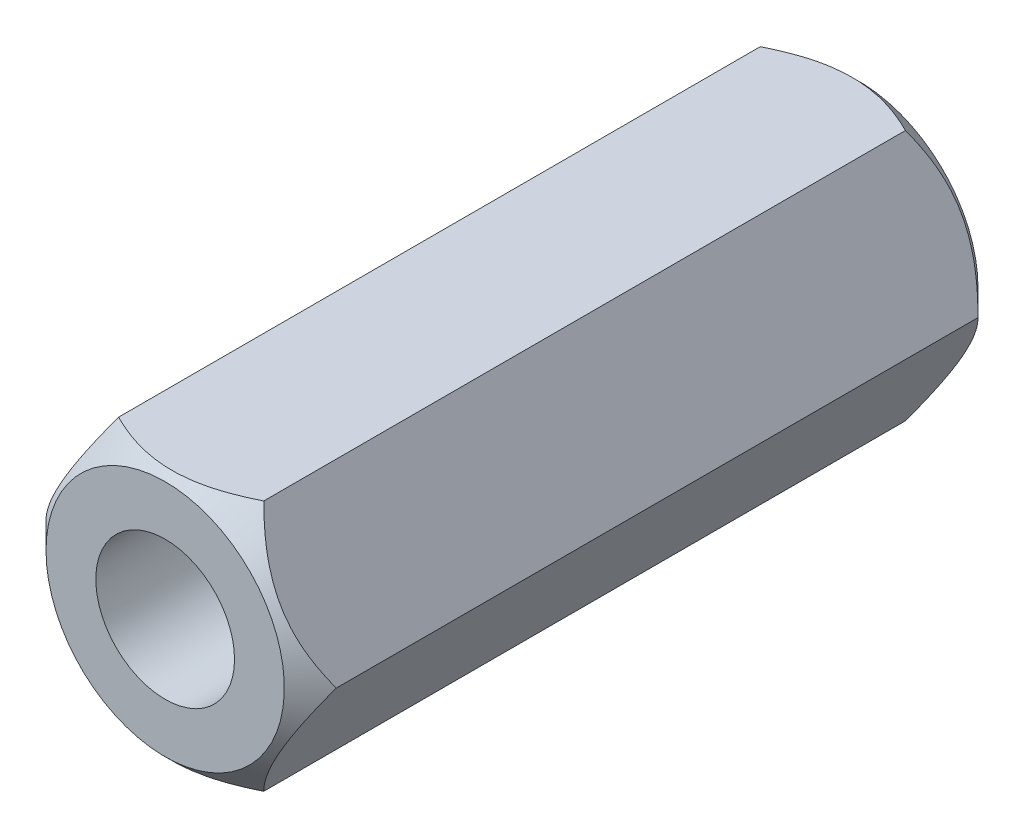
ISO-10303-21;
HEADER;
FILE_DESCRIPTION(('STEP AP214'),'2;1');
FILE_NAME('part.step','',(''),(''),'','','');
FILE_SCHEMA(('AUTOMOTIVE_DESIGN { 1 0 10303 214 1 1 1 1 }'));
ENDSEC;
DATA;
#1=APPLICATION_CONTEXT('core data for automotive mechanical design processes');
#2=APPLICATION_PROTOCOL_DEFINITION('international standard','automotive_design',2000,#1);
#3=PRODUCT_CONTEXT('',#1,'mechanical');
#4=PRODUCT('Part','Part','',(#3));
#5=PRODUCT_RELATED_PRODUCT_CATEGORY('part','',(#4));
#6=PRODUCT_DEFINITION_FORMATION('','',#4);
#7=PRODUCT_DEFINITION_CONTEXT('part definition',#1,'design');
#8=PRODUCT_DEFINITION('design','',#6,#7);
#9=PRODUCT_DEFINITION_SHAPE('','',#8);
#10=(LENGTH_UNIT() NAMED_UNIT(*) SI_UNIT(.MILLI.,.METRE.));
#11=(NAMED_UNIT(*) PLANE_ANGLE_UNIT() SI_UNIT($,.RADIAN.));
#12=(NAMED_UNIT(*) SI_UNIT($,.STERADIAN.) SOLID_ANGLE_UNIT());
#13=UNCERTAINTY_MEASURE_WITH_UNIT(LENGTH_MEASURE(1.E-05),#10,'distance_accuracy_value','');
#14=(GEOMETRIC_REPRESENTATION_CONTEXT(3) GLOBAL_UNCERTAINTY_ASSIGNED_CONTEXT((#13)) GLOBAL_UNIT_ASSIGNED_CONTEXT((#10,
#11,#12)) REPRESENTATION_CONTEXT('',''));
#15=CARTESIAN_POINT('',(0.,0.,0.));
#16=DIRECTION('',(0.,0.,1.));
#17=DIRECTION('',(1.,0.,0.));
#18=AXIS2_PLACEMENT_3D('',#15,#16,#17);
#19=CARTESIAN_POINT('',(0.,0.,4.));
#20=DIRECTION('',(0.,0.,1.));
#21=DIRECTION('',(1.,0.,0.));
#22=AXIS2_PLACEMENT_3D('',#19,#20,#21);
#23=PLANE('',#22);
#24=CARTESIAN_POINT('',(0.,0.,4.));
#25=DIRECTION('',(0.,0.,1.));
#26=DIRECTION('',(1.,0.,0.));
#27=AXIS2_PLACEMENT_3D('',#24,#25,#26);
#28=CIRCLE('',#27,0.799999999999988);
#29=CARTESIAN_POINT('',(0.799999999999988,0.,4.));
#30=VERTEX_POINT('',#29);
#31=EDGE_CURVE('E234',#30,#30,#28,.T.);
#32=ORIENTED_EDGE('',*,*,#31,.F.);
#33=EDGE_LOOP('',(#32));
#34=FACE_BOUND('',#33,.T.);
#35=CARTESIAN_POINT('',(0.,0.,4.));
#36=DIRECTION('',(0.,0.,-1.));
#37=DIRECTION('',(-1.,0.,0.));
#38=AXIS2_PLACEMENT_3D('',#35,#36,#37);
#39=CIRCLE('',#38,1.37431578064992);
#40=CARTESIAN_POINT('',(-1.37431578064992,0.,4.));
#41=VERTEX_POINT('',#40);
#42=EDGE_CURVE('E251',#41,#41,#39,.T.);
#43=ORIENTED_EDGE('',*,*,#42,.F.);
#44=EDGE_LOOP('',(#43));
#45=FACE_BOUND('',#44,.T.);
#46=ADVANCED_FACE('F43',(#34,#45),#23,.T.);
#47=CARTESIAN_POINT('',(0.,0.,-4.));
#48=DIRECTION('',(0.,0.,1.));
#49=DIRECTION('',(1.,0.,0.));
#50=AXIS2_PLACEMENT_3D('',#47,#48,#49);
#51=PLANE('',#50);
#52=CARTESIAN_POINT('',(0.,0.,-4.));
#53=DIRECTION('',(0.,0.,1.));
#54=DIRECTION('',(1.,0.,0.));
#55=AXIS2_PLACEMENT_3D('',#52,#53,#54);
#56=CIRCLE('',#55,0.799999999999998);
#57=CARTESIAN_POINT('',(0.799999999999998,0.,-4.));
#58=VERTEX_POINT('',#57);
#59=EDGE_CURVE('E238',#58,#58,#56,.T.);
#60=ORIENTED_EDGE('',*,*,#59,.T.);
#61=EDGE_LOOP('',(#60));
#62=FACE_BOUND('',#61,.T.);
#63=CARTESIAN_POINT('',(0.,0.,-4.));
#64=DIRECTION('',(0.,0.,-1.));
#65=DIRECTION('',(-1.,0.,0.));
#66=AXIS2_PLACEMENT_3D('',#63,#64,#65);
#67=CIRCLE('',#66,1.37431578064992);
#68=CARTESIAN_POINT('',(-1.37431578064992,0.,-4.));
#69=VERTEX_POINT('',#68);
#70=EDGE_CURVE('E248',#69,#69,#67,.T.);
#71=ORIENTED_EDGE('',*,*,#70,.T.);
#72=EDGE_LOOP('',(#71));
#73=FACE_BOUND('',#72,.T.);
#74=ADVANCED_FACE('F261',(#62,#73),#51,.F.);
#75=CARTESIAN_POINT('',(0.,0.,4.));
#76=DIRECTION('',(0.,0.,1.));
#77=DIRECTION('',(1.,0.,0.));
#78=AXIS2_PLACEMENT_3D('',#75,#76,#77);
#79=CYLINDRICAL_SURFACE('',#78,0.799999999999993);
#80=ORIENTED_EDGE('',*,*,#59,.F.);
#81=EDGE_LOOP('',(#80));
#82=FACE_BOUND('',#81,.T.);
#83=ORIENTED_EDGE('',*,*,#31,.T.);
#84=EDGE_LOOP('',(#83));
#85=FACE_BOUND('',#84,.T.);
#86=ADVANCED_FACE('F170',(#82,#85),#79,.F.);
#87=CARTESIAN_POINT('',(0.,0.,-3.7));
#88=DIRECTION('',(0.,0.,1.));
#89=DIRECTION('',(1.,0.,0.));
#90=AXIS2_PLACEMENT_3D('',#87,#88,#89);
#91=CONICAL_SURFACE('',#90,1.67431578064992,0.785398163397448);
#92=ORIENTED_EDGE('',*,*,#70,.F.);
#93=EDGE_LOOP('',(#92));
#94=FACE_BOUND('',#93,.T.);
#95=CARTESIAN_POINT('',(-2.53833799994803,-1.45,-2.45101972961776));
#96=CARTESIAN_POINT('',(-2.46331836099104,-1.45,-2.51613488539001));
#97=CARTESIAN_POINT('',(-2.38796727676874,-1.45,-2.58087601176472));
#98=CARTESIAN_POINT('',(-2.2363448947353,-1.45,-2.70934341764731));
#99=CARTESIAN_POINT('',(-2.16007317934021,-1.45,-2.77306920368599));
#100=CARTESIAN_POINT('',(-2.00468115799849,-1.45,-2.90060639963365));
#101=CARTESIAN_POINT('',(-1.92553547139429,-1.45,-2.96438700631668));
#102=CARTESIAN_POINT('',(-1.76575977044845,-1.45,-3.09002890579821));
#103=CARTESIAN_POINT('',(-1.68513013223553,-1.45,-3.15189067456299));
#104=CARTESIAN_POINT('',(-1.52178885563397,-1.45,-3.27304693672898));
#105=CARTESIAN_POINT('',(-1.43907464072097,-1.45,-3.33233797910738));
#106=CARTESIAN_POINT('',(-1.27093360969132,-1.45,-3.44714446678887));
#107=CARTESIAN_POINT('',(-1.18550465811648,-1.45,-3.50265682618678));
#108=CARTESIAN_POINT('',(-1.01179486194413,-1.45,-3.6075512939217));
#109=CARTESIAN_POINT('',(-0.92354032153754,-1.45,-3.65697639694552));
#110=CARTESIAN_POINT('',(-0.742673963133198,-1.45,-3.74706700163955));
#111=CARTESIAN_POINT('',(-0.650070491246379,-1.45,-3.78774850845891));
#112=CARTESIAN_POINT('',(-0.506446914842503,-1.45,-3.83908338779738));
#113=CARTESIAN_POINT('',(-0.457208808287958,-1.45,-3.85469812139962));
#114=CARTESIAN_POINT('',(-0.357560892138793,-1.45,-3.88165030843698));
#115=CARTESIAN_POINT('',(-0.307151270712443,-1.45,-3.89298844380541));
#116=CARTESIAN_POINT('',(-0.205770605157881,-1.45,-3.91063230196171));
#117=CARTESIAN_POINT('',(-0.154805120303523,-1.45,-3.91696936693882));
#118=CARTESIAN_POINT('',(-0.0524873193731552,-1.45,-3.92426298630389));
#119=CARTESIAN_POINT('',(-0.00113504720931681,-1.45,-3.92522014252399));
#120=CARTESIAN_POINT('',(0.101458755992196,-1.45,-3.92167662095126));
#121=CARTESIAN_POINT('',(0.152699978541413,-1.45,-3.91716721133384));
#122=CARTESIAN_POINT('',(0.254464432244144,-1.45,-3.90302058988481));
#123=CARTESIAN_POINT('',(0.304987517702617,-1.45,-3.89338235234612));
#124=CARTESIAN_POINT('',(0.405306713404249,-1.45,-3.86953024584431));
#125=CARTESIAN_POINT('',(0.455094973757805,-1.45,-3.85528394250204));
#126=CARTESIAN_POINT('',(0.553405063344329,-1.45,-3.82299384050317));
#127=CARTESIAN_POINT('',(0.601926872423667,-1.45,-3.80494998145566));
#128=CARTESIAN_POINT('',(0.708123175053308,-1.45,-3.76152201727827));
#129=CARTESIAN_POINT('',(0.765491264486616,-1.45,-3.73539506982482));
#130=CARTESIAN_POINT('',(0.87852163365182,-1.45,-3.67965307301422));
#131=CARTESIAN_POINT('',(0.934182909626428,-1.45,-3.65003601892923));
#132=CARTESIAN_POINT('',(1.04410278476866,-1.45,-3.58809496846838));
#133=CARTESIAN_POINT('',(1.09835857859814,-1.45,-3.55576603352409));
#134=CARTESIAN_POINT('',(1.2055979748998,-1.45,-3.48905454416926));
#135=CARTESIAN_POINT('',(1.25858132118061,-1.45,-3.45467158098587));
#136=CARTESIAN_POINT('',(1.41647415900858,-1.45,-3.34879406520293));
#137=CARTESIAN_POINT('',(1.51976889808603,-1.45,-3.27489782236396));
#138=CARTESIAN_POINT('',(1.72322995337112,-1.45,-3.12321176379583));
#139=CARTESIAN_POINT('',(1.8233995640064,-1.45,-3.04542628987386));
#140=CARTESIAN_POINT('',(2.02768051267439,-1.45,-2.88233354630457));
#141=CARTESIAN_POINT('',(2.13165672665085,-1.45,-2.79685756786544));
#142=CARTESIAN_POINT('',(2.28574850754661,-1.45,-2.6675859329184));
#143=CARTESIAN_POINT('',(2.3365192239732,-1.45,-2.62456461368331));
#144=CARTESIAN_POINT('',(2.43769089012342,-1.45,-2.53809503460582));
#145=CARTESIAN_POINT('',(2.48809186096297,-1.45,-2.49464679948109));
#146=CARTESIAN_POINT('',(2.53833799994817,-1.45,-2.45101972961793));
#147=B_SPLINE_CURVE_WITH_KNOTS('',3,(#95,#96,#97,#98,#99,#100,#101,#102,#103,#104,#105,#106,
#107,#108,#109,#110,#111,#112,#113,#114,#115,#116,#117,#118,#119,#120,#121,#122,#123,#124,#125,
#126,#127,#128,#129,#130,#131,#132,#133,#134,#135,#136,#137,#138,#139,#140,#141,#142,#143,#144,
#145,#146),.UNSPECIFIED.,.F.,.F.,(4,2,2,2,2,2,2,2,2,2,2,2,2,2,2,2,2,2,2,2,2,2,2,2,2,4),(0.,
0.298018800576393,0.596178276608139,0.901096368162233,1.20593821014569,1.51117735417883,
1.81666285656607,2.11984912072836,2.42247558456714,2.57728574730534,2.732071214041,
2.88587874644139,3.03966907257263,3.19370537422904,3.34777249297272,3.50294852964174,
3.65812703419566,3.84707928352715,4.03614060155475,4.225554019143,4.41500525834942,
4.79584297653944,5.17626464084124,5.58002191139367,5.7796614546933,5.9792895065425),.UNSPECIFIED.);
#148=CARTESIAN_POINT('',(-0.837157890324956,-1.45,-3.7));
#149=VERTEX_POINT('',#148);
#150=CARTESIAN_POINT('',(0.837157890324958,-1.45,-3.7));
#151=VERTEX_POINT('',#150);
#152=EDGE_CURVE('E101',#149,#151,#147,.T.);
#153=ORIENTED_EDGE('',*,*,#152,.F.);
#154=CARTESIAN_POINT('',(-1.67443125070375,0.00019999999999998,-3.69988451800181));
#155=CARTESIAN_POINT('',(-1.64565076332211,-0.0496492664116,-3.72864328526986));
#156=CARTESIAN_POINT('',(-1.61638899534825,-0.100332135261611,-3.755713265867));
#157=CARTESIAN_POINT('',(-1.55672083929918,-0.203680413132558,-3.80527821500315));
#158=CARTESIAN_POINT('',(-1.52630877375998,-0.256355655809565,-3.82774559781363));
#159=CARTESIAN_POINT('',(-1.46498425989508,-0.362572829573031,-3.86623291979515));
#160=CARTESIAN_POINT('',(-1.43408743698925,-0.416087696638393,-3.88234961854052));
#161=CARTESIAN_POINT('',(-1.37161344759276,-0.524295820424631,-3.90718097918017));
#162=CARTESIAN_POINT('',(-1.34003819080031,-0.578985769451193,-3.9159141833237));
#163=CARTESIAN_POINT('',(-1.28562104738329,-0.673239026652234,-3.92379383250902));
#164=CARTESIAN_POINT('',(-1.26284949387708,-0.712680514292247,-3.92496047642403));
#165=CARTESIAN_POINT('',(-1.21734655531485,-0.791493915775726,-3.92299648067089));
#166=CARTESIAN_POINT('',(-1.19461518023288,-0.830865812343602,-3.91986489255927));
#167=CARTESIAN_POINT('',(-1.14937128407616,-0.909230539219403,-3.90948459058721));
#168=CARTESIAN_POINT('',(-1.12685898665096,-0.94822298215495,-3.90223204334662));
#169=CARTESIAN_POINT('',(-1.0822122354815,-1.02555342357335,-3.88400370341238));
#170=CARTESIAN_POINT('',(-1.06007794820967,-1.06389113371749,-3.87302631258837));
#171=CARTESIAN_POINT('',(-1.00338195541679,-1.16209147382031,-3.84043563793334));
#172=CARTESIAN_POINT('',(-0.969171901403944,-1.22134502550023,-3.8163648498507));
#173=CARTESIAN_POINT('',(-0.91887041318362,-1.30846975879416,-3.77573013725844));
#174=CARTESIAN_POINT('',(-0.902294602243932,-1.33717990551836,-3.76145353445047));
#175=CARTESIAN_POINT('',(-0.869447865339242,-1.39407212270013,-3.73159681788582));
#176=CARTESIAN_POINT('',(-0.853176798259092,-1.42225443757631,-3.71601732667608));
#177=CARTESIAN_POINT('',(-0.837042420271119,-1.4502,-3.69988451800181));
#178=B_SPLINE_CURVE_WITH_KNOTS('',3,(#154,#155,#156,#157,#158,#159,#160,#161,#162,#163,#164,
#165,#166,#167,#168,#169,#170,#171,#172,#173,#174,#175,#176,#177),.UNSPECIFIED.,.F.,.F.,(4,2,2,
2,2,2,2,2,2,2,2,4),(0.,0.193169996807396,0.38746591121836,0.578675055517287,0.769402575723913,
0.905883246766929,1.04239403833694,1.17903202273957,1.3157287054464,1.53286506096538,
1.64113160060411,1.74934670064244),.UNSPECIFIED.);
#179=CARTESIAN_POINT('',(-1.67431578064992,0.,-3.7));
#180=VERTEX_POINT('',#179);
#181=EDGE_CURVE('E96',#180,#149,#178,.T.);
#182=ORIENTED_EDGE('',*,*,#181,.F.);
#183=CARTESIAN_POINT('',(-0.83704242027112,1.4502,-3.69988451800181));
#184=CARTESIAN_POINT('',(-0.865822907652762,1.4003507335884,-3.72864328526986));
#185=CARTESIAN_POINT('',(-0.895084675626619,1.34966786473839,-3.755713265867));
#186=CARTESIAN_POINT('',(-0.954752831675694,1.24631958686744,-3.80527821500315));
#187=CARTESIAN_POINT('',(-0.985164897214894,1.19364434419043,-3.82774559781362));
#188=CARTESIAN_POINT('',(-1.04648941107979,1.08742717042697,-3.86623291979515));
#189=CARTESIAN_POINT('',(-1.07738623398563,1.03391230336161,-3.88234961854052));
#190=CARTESIAN_POINT('',(-1.13986022338211,0.925704179575369,-3.90718097918017));
#191=CARTESIAN_POINT('',(-1.17143548017457,0.871014230548808,-3.9159141833237));
#192=CARTESIAN_POINT('',(-1.22585262359159,0.776760973347767,-3.92379383250902));
#193=CARTESIAN_POINT('',(-1.24862417709779,0.737319485707753,-3.92496047642403));
#194=CARTESIAN_POINT('',(-1.29412711566002,0.658506084224274,-3.92299648067089));
#195=CARTESIAN_POINT('',(-1.31685849074199,0.619134187656398,-3.91986489255927));
#196=CARTESIAN_POINT('',(-1.36210238689871,0.540769460780597,-3.90948459058721));
#197=CARTESIAN_POINT('',(-1.38461468432391,0.50177701784505,-3.90223204334662));
#198=CARTESIAN_POINT('',(-1.42926143549337,0.424446576426651,-3.88400370341238));
#199=CARTESIAN_POINT('',(-1.45139572276521,0.386108866282513,-3.87302631258837));
#200=CARTESIAN_POINT('',(-1.50809171555808,0.287908526179689,-3.84043563793334));
#201=CARTESIAN_POINT('',(-1.54230176957093,0.228654974499767,-3.81636484985069));
#202=CARTESIAN_POINT('',(-1.59260325779125,0.141530241205838,-3.77573013725844));
#203=CARTESIAN_POINT('',(-1.60917906873094,0.112820094481643,-3.76145353445047));
#204=CARTESIAN_POINT('',(-1.64202580563563,0.0559278772998721,-3.73159681788582));
#205=CARTESIAN_POINT('',(-1.65829687271578,0.0277455624236908,-3.71601732667608));
#206=CARTESIAN_POINT('',(-1.67443125070375,-0.00020000000000003,-3.69988451800181));
#207=B_SPLINE_CURVE_WITH_KNOTS('',3,(#183,#184,#185,#186,#187,#188,#189,#190,#191,#192,#193,
#194,#195,#196,#197,#198,#199,#200,#201,#202,#203,#204,#205,#206),.UNSPECIFIED.,.F.,.F.,(4,2,2,
2,2,2,2,2,2,2,2,4),(0.,0.193169996807396,0.38746591121836,0.578675055517287,0.769402575723913,
0.905883246766929,1.04239403833694,1.17903202273957,1.3157287054464,1.53286506096537,
1.64113160060411,1.74934670064243),.UNSPECIFIED.);
#208=CARTESIAN_POINT('',(-0.837157890324959,1.45,-3.7));
#209=VERTEX_POINT('',#208);
#210=EDGE_CURVE('E99',#209,#180,#207,.T.);
#211=ORIENTED_EDGE('',*,*,#210,.F.);
#212=CARTESIAN_POINT('',(2.53833799994803,1.45,-2.45101972961776));
#213=CARTESIAN_POINT('',(2.46331836099104,1.45,-2.51613488539001));
#214=CARTESIAN_POINT('',(2.38796727676874,1.45,-2.58087601176472));
#215=CARTESIAN_POINT('',(2.2363448947353,1.45,-2.70934341764731));
#216=CARTESIAN_POINT('',(2.16007317934021,1.45,-2.77306920368599));
#217=CARTESIAN_POINT('',(2.00468115799849,1.45,-2.90060639963365));
#218=CARTESIAN_POINT('',(1.92553547139429,1.45,-2.96438700631668));
#219=CARTESIAN_POINT('',(1.76575977044845,1.45,-3.09002890579821));
#220=CARTESIAN_POINT('',(1.68513013223553,1.45,-3.15189067456298));
#221=CARTESIAN_POINT('',(1.52178885563397,1.45,-3.27304693672898));
#222=CARTESIAN_POINT('',(1.43907464072097,1.45,-3.33233797910738));
#223=CARTESIAN_POINT('',(1.27093360969132,1.45,-3.44714446678887));
#224=CARTESIAN_POINT('',(1.18550465811648,1.45,-3.50265682618678));
#225=CARTESIAN_POINT('',(1.01179486194413,1.45,-3.6075512939217));
#226=CARTESIAN_POINT('',(0.923540321537541,1.45,-3.65697639694552));
#227=CARTESIAN_POINT('',(0.742673963133199,1.45,-3.74706700163955));
#228=CARTESIAN_POINT('',(0.65007049124638,1.45,-3.78774850845891));
#229=CARTESIAN_POINT('',(0.506446914842504,1.45,-3.83908338779738));
#230=CARTESIAN_POINT('',(0.457208808287959,1.45,-3.85469812139962));
#231=CARTESIAN_POINT('',(0.357560892138794,1.45,-3.88165030843698));
#232=CARTESIAN_POINT('',(0.307151270712444,1.45,-3.89298844380541));
#233=CARTESIAN_POINT('',(0.205770605157883,1.45,-3.91063230196171));
#234=CARTESIAN_POINT('',(0.154805120303524,1.45,-3.91696936693882));
#235=CARTESIAN_POINT('',(0.0524873193731561,1.45,-3.92426298630389));
#236=CARTESIAN_POINT('',(0.0011350472093177,1.45,-3.92522014252399));
#237=CARTESIAN_POINT('',(-0.101458755992195,1.45,-3.92167662095126));
#238=CARTESIAN_POINT('',(-0.152699978541412,1.45,-3.91716721133384));
#239=CARTESIAN_POINT('',(-0.254464432244144,1.45,-3.90302058988481));
#240=CARTESIAN_POINT('',(-0.304987517702617,1.45,-3.89338235234612));
#241=CARTESIAN_POINT('',(-0.405306713404249,1.45,-3.86953024584431));
#242=CARTESIAN_POINT('',(-0.455094973757805,1.45,-3.85528394250204));
#243=CARTESIAN_POINT('',(-0.553405063344329,1.45,-3.82299384050317));
#244=CARTESIAN_POINT('',(-0.601926872423667,1.45,-3.80494998145566));
#245=CARTESIAN_POINT('',(-0.708123175053308,1.45,-3.76152201727827));
#246=CARTESIAN_POINT('',(-0.765491264486616,1.45,-3.73539506982482));
#247=CARTESIAN_POINT('',(-0.87852163365182,1.45,-3.67965307301422));
#248=CARTESIAN_POINT('',(-0.934182909626428,1.45,-3.65003601892923));
#249=CARTESIAN_POINT('',(-1.04410278476866,1.45,-3.58809496846838));
#250=CARTESIAN_POINT('',(-1.09835857859814,1.45,-3.55576603352409));
#251=CARTESIAN_POINT('',(-1.2055979748998,1.45,-3.48905454416925));
#252=CARTESIAN_POINT('',(-1.25858132118061,1.45,-3.45467158098587));
#253=CARTESIAN_POINT('',(-1.41647415900859,1.45,-3.34879406520293));
#254=CARTESIAN_POINT('',(-1.51976889808603,1.45,-3.27489782236396));
#255=CARTESIAN_POINT('',(-1.72322995337112,1.45,-3.12321176379583));
#256=CARTESIAN_POINT('',(-1.8233995640064,1.45,-3.04542628987386));
#257=CARTESIAN_POINT('',(-2.0276805126744,1.45,-2.88233354630457));
#258=CARTESIAN_POINT('',(-2.13165672665085,1.45,-2.79685756786544));
#259=CARTESIAN_POINT('',(-2.28574850754661,1.45,-2.6675859329184));
#260=CARTESIAN_POINT('',(-2.3365192239732,1.45,-2.62456461368331));
#261=CARTESIAN_POINT('',(-2.43769089012342,1.45,-2.53809503460582));
#262=CARTESIAN_POINT('',(-2.48809186096297,1.45,-2.49464679948109));
#263=CARTESIAN_POINT('',(-2.53833799994817,1.45,-2.45101972961793));
#264=B_SPLINE_CURVE_WITH_KNOTS('',3,(#212,#213,#214,#215,#216,#217,#218,#219,#220,#221,#222,
#223,#224,#225,#226,#227,#228,#229,#230,#231,#232,#233,#234,#235,#236,#237,#238,#239,#240,#241,
#242,#243,#244,#245,#246,#247,#248,#249,#250,#251,#252,#253,#254,#255,#256,#257,#258,#259,#260,
#261,#262,#263),.UNSPECIFIED.,.F.,.F.,(4,2,2,2,2,2,2,2,2,2,2,2,2,2,2,2,2,2,2,2,2,2,2,2,2,4),(0.,
0.298018800576392,0.596178276608139,0.901096368162233,1.2059382101457,1.51117735417883,
1.81666285656607,2.11984912072836,2.42247558456714,2.57728574730534,2.732071214041,
2.88587874644139,3.03966907257263,3.19370537422904,3.34777249297272,3.50294852964174,
3.65812703419566,3.84707928352715,4.03614060155476,4.225554019143,4.41500525834942,
4.79584297653945,5.17626464084124,5.58002191139367,5.7796614546933,5.9792895065425),.UNSPECIFIED.);
#265=CARTESIAN_POINT('',(0.837157890324957,1.45,-3.7));
#266=VERTEX_POINT('',#265);
#267=EDGE_CURVE('E117',#266,#209,#264,.T.);
#268=ORIENTED_EDGE('',*,*,#267,.F.);
#269=CARTESIAN_POINT('',(1.67443125070375,-0.00019999999999907,-3.69988451800181));
#270=CARTESIAN_POINT('',(1.64565076332211,0.0496492664116007,-3.72864328526986));
#271=CARTESIAN_POINT('',(1.61638899534825,0.100332135261612,-3.755713265867));
#272=CARTESIAN_POINT('',(1.55672083929918,0.203680413132558,-3.80527821500315));
#273=CARTESIAN_POINT('',(1.52630877375998,0.256355655809566,-3.82774559781362));
#274=CARTESIAN_POINT('',(1.46498425989508,0.362572829573032,-3.86623291979515));
#275=CARTESIAN_POINT('',(1.43408743698925,0.416087696638393,-3.88234961854052));
#276=CARTESIAN_POINT('',(1.37161344759276,0.524295820424632,-3.90718097918017));
#277=CARTESIAN_POINT('',(1.34003819080031,0.578985769451193,-3.9159141833237));
#278=CARTESIAN_POINT('',(1.28562104738329,0.673239026652234,-3.92379383250902));
#279=CARTESIAN_POINT('',(1.26284949387709,0.712680514292247,-3.92496047642403));
#280=CARTESIAN_POINT('',(1.21734655531485,0.791493915775726,-3.92299648067089));
#281=CARTESIAN_POINT('',(1.19461518023288,0.830865812343602,-3.91986489255927));
#282=CARTESIAN_POINT('',(1.14937128407616,0.909230539219404,-3.90948459058721));
#283=CARTESIAN_POINT('',(1.12685898665097,0.94822298215495,-3.90223204334662));
#284=CARTESIAN_POINT('',(1.0822122354815,1.02555342357335,-3.88400370341238));
#285=CARTESIAN_POINT('',(1.06007794820967,1.06389113371749,-3.87302631258837));
#286=CARTESIAN_POINT('',(1.00338195541679,1.16209147382031,-3.84043563793334));
#287=CARTESIAN_POINT('',(0.969171901403945,1.22134502550023,-3.81636484985069));
#288=CARTESIAN_POINT('',(0.918870413183621,1.30846975879416,-3.77573013725844));
#289=CARTESIAN_POINT('',(0.902294602243933,1.33717990551836,-3.76145353445047));
#290=CARTESIAN_POINT('',(0.869447865339243,1.39407212270013,-3.73159681788582));
#291=CARTESIAN_POINT('',(0.853176798259093,1.42225443757631,-3.71601732667608));
#292=CARTESIAN_POINT('',(0.837042420271119,1.4502,-3.69988451800181));
#293=B_SPLINE_CURVE_WITH_KNOTS('',3,(#269,#270,#271,#272,#273,#274,#275,#276,#277,#278,#279,
#280,#281,#282,#283,#284,#285,#286,#287,#288,#289,#290,#291,#292),.UNSPECIFIED.,.F.,.F.,(4,2,2,
2,2,2,2,2,2,2,2,4),(0.,0.193169996807396,0.387465911218359,0.578675055517286,0.769402575723912,
0.905883246766928,1.04239403833694,1.17903202273957,1.3157287054464,1.53286506096537,
1.64113160060411,1.74934670064243),.UNSPECIFIED.);
#294=CARTESIAN_POINT('',(1.67431578064992,0.,-3.7));
#295=VERTEX_POINT('',#294);
#296=EDGE_CURVE('E142',#295,#266,#293,.T.);
#297=ORIENTED_EDGE('',*,*,#296,.F.);
#298=CARTESIAN_POINT('',(0.837042420271121,-1.4502,-3.69988451800181));
#299=CARTESIAN_POINT('',(0.865822907652763,-1.4003507335884,-3.72864328526986));
#300=CARTESIAN_POINT('',(0.89508467562662,-1.34966786473839,-3.755713265867));
#301=CARTESIAN_POINT('',(0.954752831675695,-1.24631958686744,-3.80527821500315));
#302=CARTESIAN_POINT('',(0.985164897214894,-1.19364434419043,-3.82774559781362));
#303=CARTESIAN_POINT('',(1.04648941107979,-1.08742717042697,-3.86623291979515));
#304=CARTESIAN_POINT('',(1.07738623398563,-1.03391230336161,-3.88234961854052));
#305=CARTESIAN_POINT('',(1.13986022338212,-0.925704179575368,-3.90718097918017));
#306=CARTESIAN_POINT('',(1.17143548017457,-0.871014230548807,-3.9159141833237));
#307=CARTESIAN_POINT('',(1.22585262359159,-0.776760973347766,-3.92379383250902));
#308=CARTESIAN_POINT('',(1.24862417709779,-0.737319485707753,-3.92496047642403));
#309=CARTESIAN_POINT('',(1.29412711566002,-0.658506084224274,-3.92299648067089));
#310=CARTESIAN_POINT('',(1.31685849074199,-0.619134187656398,-3.91986489255927));
#311=CARTESIAN_POINT('',(1.36210238689871,-0.540769460780596,-3.90948459058721));
#312=CARTESIAN_POINT('',(1.38461468432391,-0.50177701784505,-3.90223204334662));
#313=CARTESIAN_POINT('',(1.42926143549337,-0.42444657642665,-3.88400370341238));
#314=CARTESIAN_POINT('',(1.45139572276521,-0.386108866282512,-3.87302631258837));
#315=CARTESIAN_POINT('',(1.50809171555808,-0.287908526179688,-3.84043563793334));
#316=CARTESIAN_POINT('',(1.54230176957093,-0.228654974499766,-3.81636484985069));
#317=CARTESIAN_POINT('',(1.59260325779125,-0.141530241205837,-3.77573013725844));
#318=CARTESIAN_POINT('',(1.60917906873094,-0.112820094481642,-3.76145353445047));
#319=CARTESIAN_POINT('',(1.64202580563563,-0.0559278772998711,-3.73159681788582));
#320=CARTESIAN_POINT('',(1.65829687271578,-0.0277455624236898,-3.71601732667608));
#321=CARTESIAN_POINT('',(1.67443125070375,0.000200000000000983,-3.69988451800181));
#322=B_SPLINE_CURVE_WITH_KNOTS('',3,(#298,#299,#300,#301,#302,#303,#304,#305,#306,#307,#308,
#309,#310,#311,#312,#313,#314,#315,#316,#317,#318,#319,#320,#321),.UNSPECIFIED.,.F.,.F.,(4,2,2,
2,2,2,2,2,2,2,2,4),(0.,0.193169996807397,0.387465911218361,0.578675055517288,0.769402575723914,
0.905883246766929,1.04239403833694,1.17903202273957,1.3157287054464,1.53286506096538,
1.64113160060411,1.74934670064243),.UNSPECIFIED.);
#323=EDGE_CURVE('E68',#151,#295,#322,.T.);
#324=ORIENTED_EDGE('',*,*,#323,.F.);
#325=EDGE_LOOP('',(#153,#182,#211,#268,#297,#324));
#326=FACE_BOUND('',#325,.T.);
#327=ADVANCED_FACE('F98',(#94,#326),#91,.T.);
#328=CARTESIAN_POINT('',(0.,0.,4.));
#329=DIRECTION('',(0.,0.,-1.));
#330=DIRECTION('',(-1.,0.,0.));
#331=AXIS2_PLACEMENT_3D('',#328,#329,#330);
#332=CONICAL_SURFACE('',#331,1.37431578064992,0.785398163397448);
#333=ORIENTED_EDGE('',*,*,#42,.T.);
#334=EDGE_LOOP('',(#333));
#335=FACE_BOUND('',#334,.T.);
#336=CARTESIAN_POINT('',(0.837042420271119,1.4502,3.69988451800181));
#337=CARTESIAN_POINT('',(0.865822907652762,1.4003507335884,3.72864328526986));
#338=CARTESIAN_POINT('',(0.895084675626619,1.34966786473839,3.755713265867));
#339=CARTESIAN_POINT('',(0.954752831675694,1.24631958686744,3.80527821500315));
#340=CARTESIAN_POINT('',(0.985164897214893,1.19364434419043,3.82774559781362));
#341=CARTESIAN_POINT('',(1.04648941107979,1.08742717042697,3.86623291979515));
#342=CARTESIAN_POINT('',(1.07738623398563,1.03391230336161,3.88234961854052));
#343=CARTESIAN_POINT('',(1.13986022338211,0.925704179575369,3.90718097918017));
#344=CARTESIAN_POINT('',(1.17143548017457,0.871014230548808,3.9159141833237));
#345=CARTESIAN_POINT('',(1.22585262359159,0.776760973347766,3.92379383250902));
#346=CARTESIAN_POINT('',(1.24862417709779,0.737319485707753,3.92496047642403));
#347=CARTESIAN_POINT('',(1.29412711566002,0.658506084224274,3.92299648067089));
#348=CARTESIAN_POINT('',(1.31685849074199,0.619134187656398,3.91986489255927));
#349=CARTESIAN_POINT('',(1.36210238689871,0.540769460780596,3.90948459058721));
#350=CARTESIAN_POINT('',(1.38461468432391,0.50177701784505,3.90223204334662));
#351=CARTESIAN_POINT('',(1.42926143549337,0.424446576426651,3.88400370341238));
#352=CARTESIAN_POINT('',(1.45139572276521,0.386108866282513,3.87302631258837));
#353=CARTESIAN_POINT('',(1.50809171555808,0.287908526179689,3.84043563793334));
#354=CARTESIAN_POINT('',(1.54230176957093,0.228654974499767,3.81636484985069));
#355=CARTESIAN_POINT('',(1.59260325779125,0.141530241205838,3.77573013725844));
#356=CARTESIAN_POINT('',(1.60917906873094,0.112820094481643,3.76145353445047));
#357=CARTESIAN_POINT('',(1.64202580563563,0.0559278772998728,3.73159681788582));
#358=CARTESIAN_POINT('',(1.65829687271578,0.0277455624236917,3.71601732667608));
#359=CARTESIAN_POINT('',(1.67443125070375,-0.000199999999999052,3.69988451800181));
#360=B_SPLINE_CURVE_WITH_KNOTS('',3,(#336,#337,#338,#339,#340,#341,#342,#343,#344,#345,#346,
#347,#348,#349,#350,#351,#352,#353,#354,#355,#356,#357,#358,#359),.UNSPECIFIED.,.F.,.F.,(4,2,2,
2,2,2,2,2,2,2,2,4),(0.,0.193169996807396,0.38746591121836,0.578675055517287,0.769402575723914,
0.905883246766929,1.04239403833694,1.17903202273958,1.3157287054464,1.53286506096538,
1.64113160060411,1.74934670064243),.UNSPECIFIED.);
#361=CARTESIAN_POINT('',(0.837157890324957,1.45,3.7));
#362=VERTEX_POINT('',#361);
#363=CARTESIAN_POINT('',(1.67431578064992,0.,3.7));
#364=VERTEX_POINT('',#363);
#365=EDGE_CURVE('E140',#362,#364,#360,.T.);
#366=ORIENTED_EDGE('',*,*,#365,.F.);
#367=CARTESIAN_POINT('',(-2.53833799994803,1.45,2.45101972961776));
#368=CARTESIAN_POINT('',(-2.46331836099104,1.45,2.51613488539001));
#369=CARTESIAN_POINT('',(-2.38796727676874,1.45,2.58087601176472));
#370=CARTESIAN_POINT('',(-2.2363448947353,1.45,2.70934341764731));
#371=CARTESIAN_POINT('',(-2.16007317934021,1.45,2.77306920368599));
#372=CARTESIAN_POINT('',(-2.00468115799849,1.45,2.90060639963365));
#373=CARTESIAN_POINT('',(-1.92553547139429,1.45,2.96438700631668));
#374=CARTESIAN_POINT('',(-1.76575977044845,1.45,3.09002890579821));
#375=CARTESIAN_POINT('',(-1.68513013223553,1.45,3.15189067456298));
#376=CARTESIAN_POINT('',(-1.52178885563397,1.45,3.27304693672898));
#377=CARTESIAN_POINT('',(-1.43907464072097,1.45,3.33233797910738));
#378=CARTESIAN_POINT('',(-1.27093360969132,1.45,3.44714446678887));
#379=CARTESIAN_POINT('',(-1.18550465811648,1.45,3.50265682618678));
#380=CARTESIAN_POINT('',(-1.01179486194413,1.45,3.6075512939217));
#381=CARTESIAN_POINT('',(-0.923540321537541,1.45,3.65697639694552));
#382=CARTESIAN_POINT('',(-0.7426739631332,1.45,3.74706700163955));
#383=CARTESIAN_POINT('',(-0.650070491246381,1.45,3.78774850845891));
#384=CARTESIAN_POINT('',(-0.506446914842504,1.45,3.83908338779738));
#385=CARTESIAN_POINT('',(-0.457208808287959,1.45,3.85469812139962));
#386=CARTESIAN_POINT('',(-0.357560892138795,1.45,3.88165030843698));
#387=CARTESIAN_POINT('',(-0.307151270712445,1.45,3.89298844380541));
#388=CARTESIAN_POINT('',(-0.205770605157883,1.45,3.91063230196171));
#389=CARTESIAN_POINT('',(-0.154805120303525,1.45,3.91696936693882));
#390=CARTESIAN_POINT('',(-0.0524873193731566,1.45,3.92426298630389));
#391=CARTESIAN_POINT('',(-0.00113504720931822,1.45,3.92522014252399));
#392=CARTESIAN_POINT('',(0.101458755992194,1.45,3.92167662095126));
#393=CARTESIAN_POINT('',(0.152699978541412,1.45,3.91716721133384));
#394=CARTESIAN_POINT('',(0.254464432244143,1.45,3.90302058988481));
#395=CARTESIAN_POINT('',(0.304987517702616,1.45,3.89338235234612));
#396=CARTESIAN_POINT('',(0.405306713404249,1.45,3.86953024584431));
#397=CARTESIAN_POINT('',(0.455094973757805,1.45,3.85528394250204));
#398=CARTESIAN_POINT('',(0.553405063344329,1.45,3.82299384050317));
#399=CARTESIAN_POINT('',(0.601926872423666,1.45,3.80494998145566));
#400=CARTESIAN_POINT('',(0.708123175053307,1.45,3.76152201727827));
#401=CARTESIAN_POINT('',(0.765491264486616,1.45,3.73539506982482));
#402=CARTESIAN_POINT('',(0.878521633651819,1.45,3.67965307301423));
#403=CARTESIAN_POINT('',(0.934182909626427,1.45,3.65003601892923));
#404=CARTESIAN_POINT('',(1.04410278476866,1.45,3.58809496846838));
#405=CARTESIAN_POINT('',(1.09835857859814,1.45,3.55576603352409));
#406=CARTESIAN_POINT('',(1.2055979748998,1.45,3.48905454416926));
#407=CARTESIAN_POINT('',(1.25858132118061,1.45,3.45467158098587));
#408=CARTESIAN_POINT('',(1.41647415900858,1.45,3.34879406520293));
#409=CARTESIAN_POINT('',(1.51976889808603,1.45,3.27489782236396));
#410=CARTESIAN_POINT('',(1.72322995337112,1.45,3.12321176379583));
#411=CARTESIAN_POINT('',(1.8233995640064,1.45,3.04542628987386));
#412=CARTESIAN_POINT('',(2.02768051267439,1.45,2.88233354630457));
#413=CARTESIAN_POINT('',(2.13165672665085,1.45,2.79685756786544));
#414=CARTESIAN_POINT('',(2.28574850754661,1.45,2.6675859329184));
#415=CARTESIAN_POINT('',(2.3365192239732,1.45,2.62456461368331));
#416=CARTESIAN_POINT('',(2.43769089012342,1.45,2.53809503460582));
#417=CARTESIAN_POINT('',(2.48809186096297,1.45,2.49464679948109));
#418=CARTESIAN_POINT('',(2.53833799994817,1.45,2.45101972961793));
#419=B_SPLINE_CURVE_WITH_KNOTS('',3,(#367,#368,#369,#370,#371,#372,#373,#374,#375,#376,#377,
#378,#379,#380,#381,#382,#383,#384,#385,#386,#387,#388,#389,#390,#391,#392,#393,#394,#395,#396,
#397,#398,#399,#400,#401,#402,#403,#404,#405,#406,#407,#408,#409,#410,#411,#412,#413,#414,#415,
#416,#417,#418),.UNSPECIFIED.,.F.,.F.,(4,2,2,2,2,2,2,2,2,2,2,2,2,2,2,2,2,2,2,2,2,2,2,2,2,4),(0.,
0.298018800576392,0.596178276608139,0.901096368162233,1.20593821014569,1.51117735417883,
1.81666285656607,2.11984912072836,2.42247558456714,2.57728574730534,2.732071214041,
2.88587874644139,3.03966907257263,3.19370537422904,3.34777249297272,3.50294852964174,
3.65812703419566,3.84707928352715,4.03614060155476,4.225554019143,4.41500525834942,
4.79584297653944,5.17626464084124,5.58002191139367,5.7796614546933,5.9792895065425),.UNSPECIFIED.);
#420=CARTESIAN_POINT('',(-0.837157890324959,1.45,3.7));
#421=VERTEX_POINT('',#420);
#422=EDGE_CURVE('E135',#421,#362,#419,.T.);
#423=ORIENTED_EDGE('',*,*,#422,.F.);
#424=CARTESIAN_POINT('',(-1.67443125070375,-0.00020000000000002,3.69988451800181));
#425=CARTESIAN_POINT('',(-1.64565076332211,0.0496492664116,3.72864328526986));
#426=CARTESIAN_POINT('',(-1.61638899534825,0.100332135261611,3.755713265867));
#427=CARTESIAN_POINT('',(-1.55672083929918,0.203680413132558,3.80527821500315));
#428=CARTESIAN_POINT('',(-1.52630877375998,0.256355655809566,3.82774559781363));
#429=CARTESIAN_POINT('',(-1.46498425989508,0.362572829573032,3.86623291979515));
#430=CARTESIAN_POINT('',(-1.43408743698925,0.416087696638393,3.88234961854052));
#431=CARTESIAN_POINT('',(-1.37161344759276,0.524295820424632,3.90718097918017));
#432=CARTESIAN_POINT('',(-1.34003819080031,0.578985769451193,3.9159141833237));
#433=CARTESIAN_POINT('',(-1.28562104738329,0.673239026652234,3.92379383250902));
#434=CARTESIAN_POINT('',(-1.26284949387708,0.712680514292248,3.92496047642403));
#435=CARTESIAN_POINT('',(-1.21734655531485,0.791493915775727,3.92299648067089));
#436=CARTESIAN_POINT('',(-1.19461518023288,0.830865812343603,3.91986489255927));
#437=CARTESIAN_POINT('',(-1.14937128407616,0.909230539219405,3.90948459058721));
#438=CARTESIAN_POINT('',(-1.12685898665096,0.948222982154951,3.90223204334662));
#439=CARTESIAN_POINT('',(-1.0822122354815,1.02555342357335,3.88400370341238));
#440=CARTESIAN_POINT('',(-1.06007794820967,1.06389113371749,3.87302631258837));
#441=CARTESIAN_POINT('',(-1.00338195541679,1.16209147382031,3.84043563793334));
#442=CARTESIAN_POINT('',(-0.969171901403945,1.22134502550023,3.81636484985069));
#443=CARTESIAN_POINT('',(-0.918870413183621,1.30846975879416,3.77573013725844));
#444=CARTESIAN_POINT('',(-0.902294602243933,1.33717990551836,3.76145353445047));
#445=CARTESIAN_POINT('',(-0.869447865339243,1.39407212270013,3.73159681788582));
#446=CARTESIAN_POINT('',(-0.853176798259093,1.42225443757631,3.71601732667608));
#447=CARTESIAN_POINT('',(-0.83704242027112,1.4502,3.69988451800181));
#448=B_SPLINE_CURVE_WITH_KNOTS('',3,(#424,#425,#426,#427,#428,#429,#430,#431,#432,#433,#434,
#435,#436,#437,#438,#439,#440,#441,#442,#443,#444,#445,#446,#447),.UNSPECIFIED.,.F.,.F.,(4,2,2,
2,2,2,2,2,2,2,2,4),(0.,0.193169996807396,0.38746591121836,0.578675055517287,0.769402575723913,
0.905883246766929,1.04239403833694,1.17903202273957,1.3157287054464,1.53286506096538,
1.64113160060411,1.74934670064243),.UNSPECIFIED.);
#449=CARTESIAN_POINT('',(-1.67431578064992,0.,3.7));
#450=VERTEX_POINT('',#449);
#451=EDGE_CURVE('E202',#450,#421,#448,.T.);
#452=ORIENTED_EDGE('',*,*,#451,.F.);
#453=CARTESIAN_POINT('',(-0.837042420271119,-1.4502,3.69988451800181));
#454=CARTESIAN_POINT('',(-0.865822907652761,-1.4003507335884,3.72864328526986));
#455=CARTESIAN_POINT('',(-0.895084675626618,-1.34966786473839,3.755713265867));
#456=CARTESIAN_POINT('',(-0.954752831675693,-1.24631958686744,3.80527821500315));
#457=CARTESIAN_POINT('',(-0.985164897214892,-1.19364434419044,3.82774559781363));
#458=CARTESIAN_POINT('',(-1.04648941107979,-1.08742717042697,3.86623291979515));
#459=CARTESIAN_POINT('',(-1.07738623398562,-1.03391230336161,3.88234961854052));
#460=CARTESIAN_POINT('',(-1.13986022338211,-0.92570417957537,3.90718097918017));
#461=CARTESIAN_POINT('',(-1.17143548017457,-0.871014230548809,3.9159141833237));
#462=CARTESIAN_POINT('',(-1.22585262359159,-0.776760973347767,3.92379383250902));
#463=CARTESIAN_POINT('',(-1.24862417709779,-0.737319485707754,3.92496047642403));
#464=CARTESIAN_POINT('',(-1.29412711566002,-0.658506084224275,3.92299648067089));
#465=CARTESIAN_POINT('',(-1.31685849074199,-0.619134187656399,3.91986489255927));
#466=CARTESIAN_POINT('',(-1.36210238689871,-0.540769460780597,3.90948459058721));
#467=CARTESIAN_POINT('',(-1.38461468432391,-0.501777017845051,3.90223204334662));
#468=CARTESIAN_POINT('',(-1.42926143549337,-0.424446576426652,3.88400370341238));
#469=CARTESIAN_POINT('',(-1.4513957227652,-0.386108866282514,3.87302631258837));
#470=CARTESIAN_POINT('',(-1.50809171555808,-0.28790852617969,3.84043563793334));
#471=CARTESIAN_POINT('',(-1.54230176957093,-0.228654974499768,3.8163648498507));
#472=CARTESIAN_POINT('',(-1.59260325779125,-0.141530241205838,3.77573013725844));
#473=CARTESIAN_POINT('',(-1.60917906873094,-0.112820094481643,3.76145353445047));
#474=CARTESIAN_POINT('',(-1.64202580563563,-0.0559278772998723,3.73159681788582));
#475=CARTESIAN_POINT('',(-1.65829687271578,-0.027745562423691,3.71601732667608));
#476=CARTESIAN_POINT('',(-1.67443125070375,0.000200000000000008,3.69988451800181));
#477=B_SPLINE_CURVE_WITH_KNOTS('',3,(#453,#454,#455,#456,#457,#458,#459,#460,#461,#462,#463,
#464,#465,#466,#467,#468,#469,#470,#471,#472,#473,#474,#475,#476),.UNSPECIFIED.,.F.,.F.,(4,2,2,
2,2,2,2,2,2,2,2,4),(0.,0.193169996807396,0.38746591121836,0.578675055517286,0.769402575723913,
0.905883246766929,1.04239403833694,1.17903202273957,1.3157287054464,1.53286506096537,
1.64113160060411,1.74934670064243),.UNSPECIFIED.);
#478=CARTESIAN_POINT('',(-0.837157890324957,-1.45,3.7));
#479=VERTEX_POINT('',#478);
#480=EDGE_CURVE('E60',#479,#450,#477,.T.);
#481=ORIENTED_EDGE('',*,*,#480,.F.);
#482=CARTESIAN_POINT('',(2.53833799994804,-1.45,2.45101972961776));
#483=CARTESIAN_POINT('',(2.46331836099104,-1.45,2.51613488539001));
#484=CARTESIAN_POINT('',(2.38796727676874,-1.45,2.58087601176472));
#485=CARTESIAN_POINT('',(2.2363448947353,-1.45,2.70934341764731));
#486=CARTESIAN_POINT('',(2.16007317934021,-1.45,2.77306920368598));
#487=CARTESIAN_POINT('',(2.00468115799849,-1.45,2.90060639963365));
#488=CARTESIAN_POINT('',(1.92553547139429,-1.45,2.96438700631668));
#489=CARTESIAN_POINT('',(1.76575977044845,-1.45,3.09002890579821));
#490=CARTESIAN_POINT('',(1.68513013223553,-1.45,3.15189067456298));
#491=CARTESIAN_POINT('',(1.52178885563397,-1.45,3.27304693672898));
#492=CARTESIAN_POINT('',(1.43907464072097,-1.45,3.33233797910738));
#493=CARTESIAN_POINT('',(1.27093360969132,-1.45,3.44714446678887));
#494=CARTESIAN_POINT('',(1.18550465811648,-1.45,3.50265682618678));
#495=CARTESIAN_POINT('',(1.01179486194413,-1.45,3.6075512939217));
#496=CARTESIAN_POINT('',(0.923540321537541,-1.45,3.65697639694552));
#497=CARTESIAN_POINT('',(0.742673963133199,-1.45,3.74706700163955));
#498=CARTESIAN_POINT('',(0.65007049124638,-1.45,3.78774850845891));
#499=CARTESIAN_POINT('',(0.506446914842504,-1.45,3.83908338779738));
#500=CARTESIAN_POINT('',(0.457208808287958,-1.45,3.85469812139962));
#501=CARTESIAN_POINT('',(0.357560892138794,-1.45,3.88165030843698));
#502=CARTESIAN_POINT('',(0.307151270712444,-1.45,3.89298844380541));
#503=CARTESIAN_POINT('',(0.205770605157882,-1.45,3.91063230196171));
#504=CARTESIAN_POINT('',(0.154805120303524,-1.45,3.91696936693882));
#505=CARTESIAN_POINT('',(0.0524873193731551,-1.45,3.92426298630389));
#506=CARTESIAN_POINT('',(0.00113504720931675,-1.45,3.92522014252399));
#507=CARTESIAN_POINT('',(-0.101458755992196,-1.45,3.92167662095126));
#508=CARTESIAN_POINT('',(-0.152699978541413,-1.45,3.91716721133384));
#509=CARTESIAN_POINT('',(-0.254464432244145,-1.45,3.90302058988481));
#510=CARTESIAN_POINT('',(-0.304987517702618,-1.45,3.89338235234612));
#511=CARTESIAN_POINT('',(-0.40530671340425,-1.45,3.86953024584431));
#512=CARTESIAN_POINT('',(-0.455094973757806,-1.45,3.85528394250204));
#513=CARTESIAN_POINT('',(-0.55340506334433,-1.45,3.82299384050317));
#514=CARTESIAN_POINT('',(-0.601926872423668,-1.45,3.80494998145566));
#515=CARTESIAN_POINT('',(-0.708123175053309,-1.45,3.76152201727827));
#516=CARTESIAN_POINT('',(-0.765491264486617,-1.45,3.73539506982482));
#517=CARTESIAN_POINT('',(-0.878521633651821,-1.45,3.67965307301422));
#518=CARTESIAN_POINT('',(-0.934182909626428,-1.45,3.65003601892923));
#519=CARTESIAN_POINT('',(-1.04410278476866,-1.45,3.58809496846838));
#520=CARTESIAN_POINT('',(-1.09835857859814,-1.45,3.55576603352409));
#521=CARTESIAN_POINT('',(-1.2055979748998,-1.45,3.48905454416925));
#522=CARTESIAN_POINT('',(-1.25858132118061,-1.45,3.45467158098587));
#523=CARTESIAN_POINT('',(-1.41647415900859,-1.45,3.34879406520293));
#524=CARTESIAN_POINT('',(-1.51976889808603,-1.45,3.27489782236396));
#525=CARTESIAN_POINT('',(-1.72322995337112,-1.45,3.12321176379583));
#526=CARTESIAN_POINT('',(-1.8233995640064,-1.45,3.04542628987386));
#527=CARTESIAN_POINT('',(-2.0276805126744,-1.45,2.88233354630457));
#528=CARTESIAN_POINT('',(-2.13165672665086,-1.45,2.79685756786544));
#529=CARTESIAN_POINT('',(-2.28574850754661,-1.45,2.6675859329184));
#530=CARTESIAN_POINT('',(-2.3365192239732,-1.45,2.62456461368331));
#531=CARTESIAN_POINT('',(-2.43769089012342,-1.45,2.53809503460582));
#532=CARTESIAN_POINT('',(-2.48809186096297,-1.45,2.49464679948109));
#533=CARTESIAN_POINT('',(-2.53833799994817,-1.45,2.45101972961793));
#534=B_SPLINE_CURVE_WITH_KNOTS('',3,(#482,#483,#484,#485,#486,#487,#488,#489,#490,#491,#492,
#493,#494,#495,#496,#497,#498,#499,#500,#501,#502,#503,#504,#505,#506,#507,#508,#509,#510,#511,
#512,#513,#514,#515,#516,#517,#518,#519,#520,#521,#522,#523,#524,#525,#526,#527,#528,#529,#530,
#531,#532,#533),.UNSPECIFIED.,.F.,.F.,(4,2,2,2,2,2,2,2,2,2,2,2,2,2,2,2,2,2,2,2,2,2,2,2,2,4),(0.,
0.298018800576392,0.596178276608138,0.901096368162233,1.2059382101457,1.51117735417884,
1.81666285656607,2.11984912072836,2.42247558456714,2.57728574730534,2.732071214041,
2.88587874644139,3.03966907257263,3.19370537422904,3.34777249297272,3.50294852964174,
3.65812703419566,3.84707928352715,4.03614060155476,4.225554019143,4.41500525834942,
4.79584297653945,5.17626464084124,5.58002191139367,5.7796614546933,5.97928950654249),.UNSPECIFIED.);
#535=CARTESIAN_POINT('',(0.837157890324956,-1.45,3.7));
#536=VERTEX_POINT('',#535);
#537=EDGE_CURVE('E147',#536,#479,#534,.T.);
#538=ORIENTED_EDGE('',*,*,#537,.F.);
#539=CARTESIAN_POINT('',(1.67443125070375,0.000200000000000867,3.69988451800181));
#540=CARTESIAN_POINT('',(1.64565076332211,-0.049649266411599,3.72864328526986));
#541=CARTESIAN_POINT('',(1.61638899534825,-0.100332135261611,3.755713265867));
#542=CARTESIAN_POINT('',(1.55672083929918,-0.203680413132557,3.80527821500315));
#543=CARTESIAN_POINT('',(1.52630877375998,-0.256355655809565,3.82774559781362));
#544=CARTESIAN_POINT('',(1.46498425989508,-0.362572829573031,3.86623291979515));
#545=CARTESIAN_POINT('',(1.43408743698925,-0.416087696638393,3.88234961854052));
#546=CARTESIAN_POINT('',(1.37161344759276,-0.524295820424631,3.90718097918017));
#547=CARTESIAN_POINT('',(1.34003819080031,-0.578985769451192,3.9159141833237));
#548=CARTESIAN_POINT('',(1.28562104738329,-0.673239026652233,3.92379383250902));
#549=CARTESIAN_POINT('',(1.26284949387709,-0.712680514292247,3.92496047642403));
#550=CARTESIAN_POINT('',(1.21734655531485,-0.791493915775726,3.92299648067089));
#551=CARTESIAN_POINT('',(1.19461518023288,-0.830865812343601,3.91986489255927));
#552=CARTESIAN_POINT('',(1.14937128407616,-0.909230539219403,3.90948459058721));
#553=CARTESIAN_POINT('',(1.12685898665097,-0.94822298215495,3.90223204334662));
#554=CARTESIAN_POINT('',(1.0822122354815,-1.02555342357335,3.88400370341238));
#555=CARTESIAN_POINT('',(1.06007794820967,-1.06389113371749,3.87302631258837));
#556=CARTESIAN_POINT('',(1.00338195541679,-1.16209147382031,3.84043563793334));
#557=CARTESIAN_POINT('',(0.969171901403946,-1.22134502550023,3.81636484985069));
#558=CARTESIAN_POINT('',(0.918870413183621,-1.30846975879416,3.77573013725844));
#559=CARTESIAN_POINT('',(0.902294602243934,-1.33717990551836,3.76145353445047));
#560=CARTESIAN_POINT('',(0.869447865339244,-1.39407212270013,3.73159681788582));
#561=CARTESIAN_POINT('',(0.853176798259094,-1.42225443757631,3.71601732667608));
#562=CARTESIAN_POINT('',(0.837042420271121,-1.4502,3.69988451800181));
#563=B_SPLINE_CURVE_WITH_KNOTS('',3,(#539,#540,#541,#542,#543,#544,#545,#546,#547,#548,#549,
#550,#551,#552,#553,#554,#555,#556,#557,#558,#559,#560,#561,#562),.UNSPECIFIED.,.F.,.F.,(4,2,2,
2,2,2,2,2,2,2,2,4),(0.,0.193169996807396,0.38746591121836,0.578675055517287,0.769402575723913,
0.905883246766928,1.04239403833694,1.17903202273957,1.3157287054464,1.53286506096538,
1.64113160060411,1.74934670064243),.UNSPECIFIED.);
#564=EDGE_CURVE('E226',#364,#536,#563,.T.);
#565=ORIENTED_EDGE('',*,*,#564,.F.);
#566=EDGE_LOOP('',(#366,#423,#452,#481,#538,#565));
#567=FACE_BOUND('',#566,.T.);
#568=ADVANCED_FACE('F169',(#335,#567),#332,.T.);
#569=CARTESIAN_POINT('',(-0.837157890324957,-1.45,4.));
#570=DIRECTION('',(0.,1.,0.));
#571=DIRECTION('',(-1.,0.,0.));
#572=AXIS2_PLACEMENT_3D('',#569,#570,#571);
#573=PLANE('',#572);
#574=DIRECTION('',(0.,0.,-1.));
#575=VECTOR('',#574,1.);
#576=CARTESIAN_POINT('',(-0.837157890324957,-1.45,4.));
#577=LINE('',#576,#575);
#578=EDGE_CURVE('E121',#479,#149,#577,.T.);
#579=ORIENTED_EDGE('',*,*,#578,.T.);
#580=ORIENTED_EDGE('',*,*,#152,.T.);
#581=DIRECTION('',(0.,0.,-1.));
#582=VECTOR('',#581,1.);
#583=CARTESIAN_POINT('',(0.837157890324958,-1.45,4.));
#584=LINE('',#583,#582);
#585=EDGE_CURVE('E126',#536,#151,#584,.T.);
#586=ORIENTED_EDGE('',*,*,#585,.F.);
#587=ORIENTED_EDGE('',*,*,#537,.T.);
#588=EDGE_LOOP('',(#579,#580,#586,#587));
#589=FACE_BOUND('',#588,.T.);
#590=ADVANCED_FACE('F246',(#589),#573,.F.);
#591=CARTESIAN_POINT('',(-1.67431578064992,0.,4.));
#592=DIRECTION('',(0.866025403784438,0.5,0.));
#593=DIRECTION('',(-0.5,0.866025403784439,0.));
#594=AXIS2_PLACEMENT_3D('',#591,#592,#593);
#595=PLANE('',#594);
#596=DIRECTION('',(0.,0.,-1.));
#597=VECTOR('',#596,1.);
#598=CARTESIAN_POINT('',(-1.67431578064992,0.,4.));
#599=LINE('',#598,#597);
#600=EDGE_CURVE('E113',#450,#180,#599,.T.);
#601=ORIENTED_EDGE('',*,*,#600,.T.);
#602=ORIENTED_EDGE('',*,*,#181,.T.);
#603=ORIENTED_EDGE('',*,*,#578,.F.);
#604=ORIENTED_EDGE('',*,*,#480,.T.);
#605=EDGE_LOOP('',(#601,#602,#603,#604));
#606=FACE_BOUND('',#605,.T.);
#607=ADVANCED_FACE('F119',(#606),#595,.F.);
#608=CARTESIAN_POINT('',(-0.837157890324958,1.45,4.));
#609=DIRECTION('',(0.866025403784439,-0.5,0.));
#610=DIRECTION('',(0.5,0.866025403784439,0.));
#611=AXIS2_PLACEMENT_3D('',#608,#609,#610);
#612=PLANE('',#611);
#613=DIRECTION('',(0.,0.,-1.));
#614=VECTOR('',#613,1.);
#615=CARTESIAN_POINT('',(-0.837157890324958,1.45,4.));
#616=LINE('',#615,#614);
#617=EDGE_CURVE('E115',#421,#209,#616,.T.);
#618=ORIENTED_EDGE('',*,*,#617,.T.);
#619=ORIENTED_EDGE('',*,*,#210,.T.);
#620=ORIENTED_EDGE('',*,*,#600,.F.);
#621=ORIENTED_EDGE('',*,*,#451,.T.);
#622=EDGE_LOOP('',(#618,#619,#620,#621));
#623=FACE_BOUND('',#622,.T.);
#624=ADVANCED_FACE('F111',(#623),#612,.F.);
#625=CARTESIAN_POINT('',(0.837157890324957,1.45,4.));
#626=DIRECTION('',(0.,-1.,0.));
#627=DIRECTION('',(0.,0.,-1.));
#628=AXIS2_PLACEMENT_3D('',#625,#626,#627);
#629=PLANE('',#628);
#630=DIRECTION('',(0.,0.,-1.));
#631=VECTOR('',#630,1.);
#632=CARTESIAN_POINT('',(0.837157890324957,1.45,4.));
#633=LINE('',#632,#631);
#634=EDGE_CURVE('E53',#362,#266,#633,.T.);
#635=ORIENTED_EDGE('',*,*,#634,.T.);
#636=ORIENTED_EDGE('',*,*,#267,.T.);
#637=ORIENTED_EDGE('',*,*,#617,.F.);
#638=ORIENTED_EDGE('',*,*,#422,.T.);
#639=EDGE_LOOP('',(#635,#636,#637,#638));
#640=FACE_BOUND('',#639,.T.);
#641=ADVANCED_FACE('F134',(#640),#629,.F.);
#642=CARTESIAN_POINT('',(1.67431578064992,0.,4.));
#643=DIRECTION('',(-0.866025403784439,-0.5,0.));
#644=DIRECTION('',(0.5,-0.866025403784438,0.));
#645=AXIS2_PLACEMENT_3D('',#642,#643,#644);
#646=PLANE('',#645);
#647=DIRECTION('',(0.,0.,-1.));
#648=VECTOR('',#647,1.);
#649=CARTESIAN_POINT('',(1.67431578064992,0.,4.));
#650=LINE('',#649,#648);
#651=EDGE_CURVE('E11',#364,#295,#650,.T.);
#652=ORIENTED_EDGE('',*,*,#651,.T.);
#653=ORIENTED_EDGE('',*,*,#296,.T.);
#654=ORIENTED_EDGE('',*,*,#634,.F.);
#655=ORIENTED_EDGE('',*,*,#365,.T.);
#656=EDGE_LOOP('',(#652,#653,#654,#655));
#657=FACE_BOUND('',#656,.T.);
#658=ADVANCED_FACE('F139',(#657),#646,.F.);
#659=CARTESIAN_POINT('',(0.837157890324958,-1.45,4.));
#660=DIRECTION('',(-0.866025403784439,0.499999999999999,0.));
#661=DIRECTION('',(-0.499999999999999,-0.866025403784439,0.));
#662=AXIS2_PLACEMENT_3D('',#659,#660,#661);
#663=PLANE('',#662);
#664=ORIENTED_EDGE('',*,*,#585,.T.);
#665=ORIENTED_EDGE('',*,*,#323,.T.);
#666=ORIENTED_EDGE('',*,*,#651,.F.);
#667=ORIENTED_EDGE('',*,*,#564,.T.);
#668=EDGE_LOOP('',(#664,#665,#666,#667));
#669=FACE_BOUND('',#668,.T.);
#670=ADVANCED_FACE('F45',(#669),#663,.F.);
#671=CLOSED_SHELL('',(#46,#74,#86,#327,#568,#590,#607,#624,#641,#658,#670));
#672=MANIFOLD_SOLID_BREP('B2',#671);
#673=ADVANCED_BREP_SHAPE_REPRESENTATION('',(#18,#672),#14);
#674=SHAPE_DEFINITION_REPRESENTATION(#9,#673);
ENDSEC;
END-ISO-10303-21;
